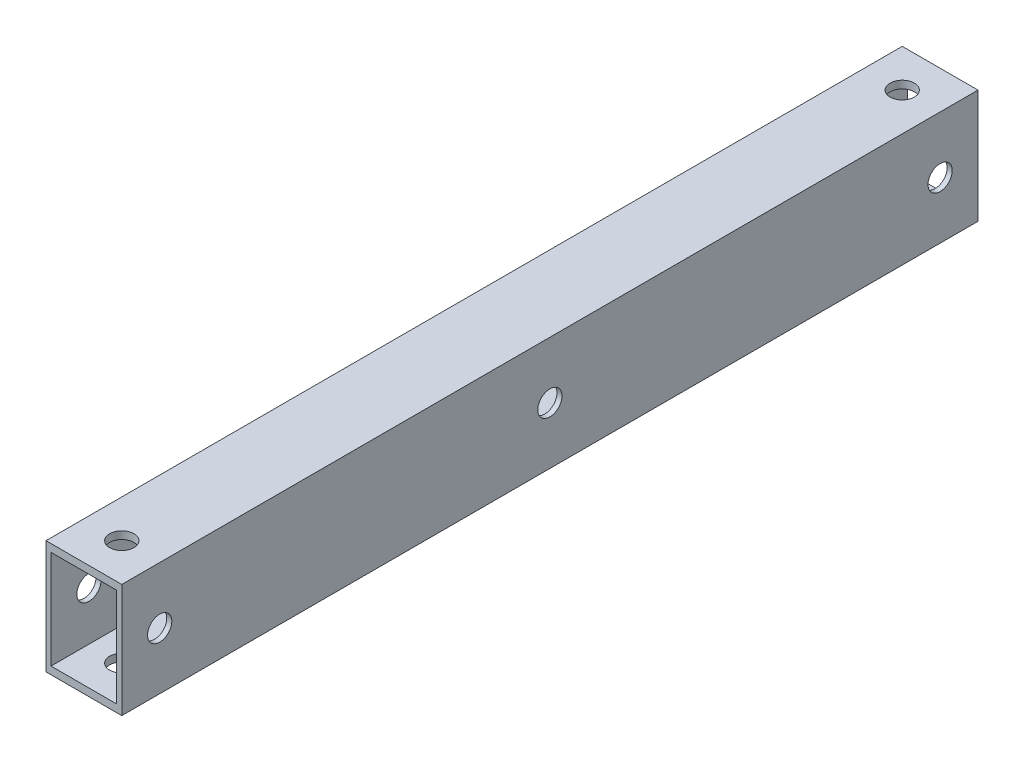
ISO-10303-21;
HEADER;
FILE_DESCRIPTION(('STEP AP214'),'2;1');
FILE_NAME('part.step','',(''),(''),'','','');
FILE_SCHEMA(('AUTOMOTIVE_DESIGN { 1 0 10303 214 1 1 1 1 }'));
ENDSEC;
DATA;
#1=APPLICATION_CONTEXT('core data for automotive mechanical design processes');
#2=APPLICATION_PROTOCOL_DEFINITION('international standard','automotive_design',2000,#1);
#3=PRODUCT_CONTEXT('',#1,'mechanical');
#4=PRODUCT('Part','Part','',(#3));
#5=PRODUCT_RELATED_PRODUCT_CATEGORY('part','',(#4));
#6=PRODUCT_DEFINITION_FORMATION('','',#4);
#7=PRODUCT_DEFINITION_CONTEXT('part definition',#1,'design');
#8=PRODUCT_DEFINITION('design','',#6,#7);
#9=PRODUCT_DEFINITION_SHAPE('','',#8);
#10=(LENGTH_UNIT() NAMED_UNIT(*) SI_UNIT(.MILLI.,.METRE.));
#11=(NAMED_UNIT(*) PLANE_ANGLE_UNIT() SI_UNIT($,.RADIAN.));
#12=(NAMED_UNIT(*) SI_UNIT($,.STERADIAN.) SOLID_ANGLE_UNIT());
#13=UNCERTAINTY_MEASURE_WITH_UNIT(LENGTH_MEASURE(1.E-05),#10,'distance_accuracy_value','');
#14=(GEOMETRIC_REPRESENTATION_CONTEXT(3) GLOBAL_UNCERTAINTY_ASSIGNED_CONTEXT((#13)) GLOBAL_UNIT_ASSIGNED_CONTEXT((#10,
#11,#12)) REPRESENTATION_CONTEXT('',''));
#15=CARTESIAN_POINT('',(0.,0.,0.));
#16=DIRECTION('',(0.,0.,1.));
#17=DIRECTION('',(1.,0.,0.));
#18=AXIS2_PLACEMENT_3D('',#15,#16,#17);
#19=CARTESIAN_POINT('',(5.,-7.5,56.5));
#20=DIRECTION('',(-1.,0.,0.));
#21=DIRECTION('',(0.,0.,1.));
#22=AXIS2_PLACEMENT_3D('',#19,#20,#21);
#23=PLANE('',#22);
#24=CARTESIAN_POINT('',(5.,0.,-51.5));
#25=DIRECTION('',(1.,0.,0.));
#26=DIRECTION('',(0.,0.,-1.));
#27=AXIS2_PLACEMENT_3D('',#24,#25,#26);
#28=CIRCLE('',#27,1.6);
#29=CARTESIAN_POINT('',(5.,0.,-53.1));
#30=VERTEX_POINT('',#29);
#31=EDGE_CURVE('E220',#30,#30,#28,.T.);
#32=ORIENTED_EDGE('',*,*,#31,.F.);
#33=EDGE_LOOP('',(#32));
#34=FACE_BOUND('',#33,.T.);
#35=DIRECTION('',(0.,0.,-1.));
#36=VECTOR('',#35,1.);
#37=CARTESIAN_POINT('',(5.,-7.5,56.5));
#38=LINE('',#37,#36);
#39=CARTESIAN_POINT('',(5.,-7.5,56.5));
#40=VERTEX_POINT('',#39);
#41=CARTESIAN_POINT('',(5.,-7.5,-56.5));
#42=VERTEX_POINT('',#41);
#43=EDGE_CURVE('E190',#40,#42,#38,.T.);
#44=ORIENTED_EDGE('',*,*,#43,.T.);
#45=DIRECTION('',(0.,1.,0.));
#46=VECTOR('',#45,1.);
#47=CARTESIAN_POINT('',(5.,-7.5,-56.5));
#48=LINE('',#47,#46);
#49=CARTESIAN_POINT('',(5.,7.5,-56.5));
#50=VERTEX_POINT('',#49);
#51=EDGE_CURVE('E131',#42,#50,#48,.T.);
#52=ORIENTED_EDGE('',*,*,#51,.T.);
#53=DIRECTION('',(0.,0.,-1.));
#54=VECTOR('',#53,1.);
#55=CARTESIAN_POINT('',(5.,7.5,56.5));
#56=LINE('',#55,#54);
#57=CARTESIAN_POINT('',(5.,7.5,56.5));
#58=VERTEX_POINT('',#57);
#59=EDGE_CURVE('E42',#58,#50,#56,.T.);
#60=ORIENTED_EDGE('',*,*,#59,.F.);
#61=DIRECTION('',(0.,1.,0.));
#62=VECTOR('',#61,1.);
#63=CARTESIAN_POINT('',(5.,-7.5,56.5));
#64=LINE('',#63,#62);
#65=EDGE_CURVE('E183',#40,#58,#64,.T.);
#66=ORIENTED_EDGE('',*,*,#65,.F.);
#67=EDGE_LOOP('',(#44,#52,#60,#66));
#68=FACE_BOUND('',#67,.T.);
#69=CARTESIAN_POINT('',(5.,0.,51.5));
#70=DIRECTION('',(-1.,0.,0.));
#71=DIRECTION('',(0.,0.,1.));
#72=AXIS2_PLACEMENT_3D('',#69,#70,#71);
#73=CIRCLE('',#72,1.6);
#74=CARTESIAN_POINT('',(5.,0.,53.1));
#75=VERTEX_POINT('',#74);
#76=EDGE_CURVE('E144',#75,#75,#73,.T.);
#77=ORIENTED_EDGE('',*,*,#76,.T.);
#78=EDGE_LOOP('',(#77));
#79=FACE_BOUND('',#78,.T.);
#80=CARTESIAN_POINT('',(5.,0.,0.));
#81=DIRECTION('',(1.,0.,0.));
#82=DIRECTION('',(0.,0.,-1.));
#83=AXIS2_PLACEMENT_3D('',#80,#81,#82);
#84=CIRCLE('',#83,1.6);
#85=CARTESIAN_POINT('',(5.,0.,-1.6));
#86=VERTEX_POINT('',#85);
#87=EDGE_CURVE('E163',#86,#86,#84,.T.);
#88=ORIENTED_EDGE('',*,*,#87,.F.);
#89=EDGE_LOOP('',(#88));
#90=FACE_BOUND('',#89,.T.);
#91=ADVANCED_FACE('F34',(#34,#68,#79,#90),#23,.F.);
#92=CARTESIAN_POINT('',(4.33333333333333,-6.5,56.5));
#93=DIRECTION('',(-1.,0.,0.));
#94=DIRECTION('',(0.,0.,1.));
#95=AXIS2_PLACEMENT_3D('',#92,#93,#94);
#96=PLANE('',#95);
#97=CARTESIAN_POINT('',(4.33333333333333,0.,-51.5));
#98=DIRECTION('',(-1.,0.,0.));
#99=DIRECTION('',(0.,0.,1.));
#100=AXIS2_PLACEMENT_3D('',#97,#98,#99);
#101=CIRCLE('',#100,1.6);
#102=CARTESIAN_POINT('',(4.33333333333333,0.,-49.9));
#103=VERTEX_POINT('',#102);
#104=EDGE_CURVE('E212',#103,#103,#101,.F.);
#105=ORIENTED_EDGE('',*,*,#104,.T.);
#106=EDGE_LOOP('',(#105));
#107=FACE_BOUND('',#106,.T.);
#108=CARTESIAN_POINT('',(4.33333333333333,0.,51.5));
#109=DIRECTION('',(-1.,0.,0.));
#110=DIRECTION('',(0.,0.,1.));
#111=AXIS2_PLACEMENT_3D('',#108,#109,#110);
#112=CIRCLE('',#111,1.6);
#113=CARTESIAN_POINT('',(4.33333333333333,0.,53.1));
#114=VERTEX_POINT('',#113);
#115=EDGE_CURVE('E150',#114,#114,#112,.T.);
#116=ORIENTED_EDGE('',*,*,#115,.F.);
#117=EDGE_LOOP('',(#116));
#118=FACE_BOUND('',#117,.T.);
#119=DIRECTION('',(0.,1.,0.));
#120=VECTOR('',#119,1.);
#121=CARTESIAN_POINT('',(4.33333333333333,-6.5,-56.5));
#122=LINE('',#121,#120);
#123=CARTESIAN_POINT('',(4.33333333333333,-6.5,-56.5));
#124=VERTEX_POINT('',#123);
#125=CARTESIAN_POINT('',(4.33333333333333,6.5,-56.5));
#126=VERTEX_POINT('',#125);
#127=EDGE_CURVE('E111',#124,#126,#122,.T.);
#128=ORIENTED_EDGE('',*,*,#127,.F.);
#129=DIRECTION('',(0.,0.,-1.));
#130=VECTOR('',#129,1.);
#131=CARTESIAN_POINT('',(4.33333333333333,-6.5,56.5));
#132=LINE('',#131,#130);
#133=CARTESIAN_POINT('',(4.33333333333333,-6.5,56.5));
#134=VERTEX_POINT('',#133);
#135=EDGE_CURVE('E99',#134,#124,#132,.T.);
#136=ORIENTED_EDGE('',*,*,#135,.F.);
#137=DIRECTION('',(0.,1.,0.));
#138=VECTOR('',#137,1.);
#139=CARTESIAN_POINT('',(4.33333333333333,-6.5,56.5));
#140=LINE('',#139,#138);
#141=CARTESIAN_POINT('',(4.33333333333333,6.5,56.5));
#142=VERTEX_POINT('',#141);
#143=EDGE_CURVE('E172',#134,#142,#140,.T.);
#144=ORIENTED_EDGE('',*,*,#143,.T.);
#145=DIRECTION('',(0.,0.,-1.));
#146=VECTOR('',#145,1.);
#147=CARTESIAN_POINT('',(4.33333333333333,6.5,56.5));
#148=LINE('',#147,#146);
#149=EDGE_CURVE('E115',#142,#126,#148,.T.);
#150=ORIENTED_EDGE('',*,*,#149,.T.);
#151=EDGE_LOOP('',(#128,#136,#144,#150));
#152=FACE_BOUND('',#151,.T.);
#153=CARTESIAN_POINT('',(4.33333333333334,0.,0.));
#154=DIRECTION('',(-1.,0.,0.));
#155=DIRECTION('',(0.,0.,1.));
#156=AXIS2_PLACEMENT_3D('',#153,#154,#155);
#157=CIRCLE('',#156,1.6);
#158=CARTESIAN_POINT('',(4.33333333333334,0.,1.6));
#159=VERTEX_POINT('',#158);
#160=EDGE_CURVE('E167',#159,#159,#157,.T.);
#161=ORIENTED_EDGE('',*,*,#160,.F.);
#162=EDGE_LOOP('',(#161));
#163=FACE_BOUND('',#162,.T.);
#164=ADVANCED_FACE('F112',(#107,#118,#152,#163),#96,.T.);
#165=CARTESIAN_POINT('',(0.,0.,56.5));
#166=DIRECTION('',(0.,0.,-1.));
#167=DIRECTION('',(-1.,0.,0.));
#168=AXIS2_PLACEMENT_3D('',#165,#166,#167);
#169=PLANE('',#168);
#170=ORIENTED_EDGE('',*,*,#65,.T.);
#171=DIRECTION('',(-1.,0.,0.));
#172=VECTOR('',#171,1.);
#173=CARTESIAN_POINT('',(-5.,7.5,56.5));
#174=LINE('',#173,#172);
#175=CARTESIAN_POINT('',(-5.,7.5,56.5));
#176=VERTEX_POINT('',#175);
#177=EDGE_CURVE('E185',#58,#176,#174,.T.);
#178=ORIENTED_EDGE('',*,*,#177,.T.);
#179=DIRECTION('',(0.,-1.,0.));
#180=VECTOR('',#179,1.);
#181=CARTESIAN_POINT('',(-5.,-7.5,56.5));
#182=LINE('',#181,#180);
#183=CARTESIAN_POINT('',(-5.,-7.5,56.5));
#184=VERTEX_POINT('',#183);
#185=EDGE_CURVE('E187',#176,#184,#182,.T.);
#186=ORIENTED_EDGE('',*,*,#185,.T.);
#187=DIRECTION('',(1.,0.,0.));
#188=VECTOR('',#187,1.);
#189=CARTESIAN_POINT('',(-5.,-7.5,56.5));
#190=LINE('',#189,#188);
#191=EDGE_CURVE('E58',#184,#40,#190,.T.);
#192=ORIENTED_EDGE('',*,*,#191,.T.);
#193=EDGE_LOOP('',(#170,#178,#186,#192));
#194=FACE_BOUND('',#193,.T.);
#195=ORIENTED_EDGE('',*,*,#143,.F.);
#196=DIRECTION('',(1.,0.,0.));
#197=VECTOR('',#196,1.);
#198=CARTESIAN_POINT('',(-4.33333333333334,-6.5,56.5));
#199=LINE('',#198,#197);
#200=CARTESIAN_POINT('',(-4.33333333333334,-6.5,56.5));
#201=VERTEX_POINT('',#200);
#202=EDGE_CURVE('E106',#201,#134,#199,.T.);
#203=ORIENTED_EDGE('',*,*,#202,.F.);
#204=DIRECTION('',(0.,-1.,0.));
#205=VECTOR('',#204,1.);
#206=CARTESIAN_POINT('',(-4.33333333333334,-6.5,56.5));
#207=LINE('',#206,#205);
#208=CARTESIAN_POINT('',(-4.33333333333334,6.5,56.5));
#209=VERTEX_POINT('',#208);
#210=EDGE_CURVE('E176',#209,#201,#207,.T.);
#211=ORIENTED_EDGE('',*,*,#210,.F.);
#212=DIRECTION('',(-1.,0.,0.));
#213=VECTOR('',#212,1.);
#214=CARTESIAN_POINT('',(-4.33333333333334,6.5,56.5));
#215=LINE('',#214,#213);
#216=EDGE_CURVE('E174',#142,#209,#215,.T.);
#217=ORIENTED_EDGE('',*,*,#216,.F.);
#218=EDGE_LOOP('',(#195,#203,#211,#217));
#219=FACE_BOUND('',#218,.T.);
#220=ADVANCED_FACE('F261',(#194,#219),#169,.F.);
#221=CARTESIAN_POINT('',(-5.,7.5,56.5));
#222=DIRECTION('',(0.,-1.,0.));
#223=DIRECTION('',(0.,0.,-1.));
#224=AXIS2_PLACEMENT_3D('',#221,#222,#223);
#225=PLANE('',#224);
#226=CARTESIAN_POINT('',(0.,7.5,-51.5));
#227=DIRECTION('',(0.,-1.,0.));
#228=DIRECTION('',(0.,0.,-1.));
#229=AXIS2_PLACEMENT_3D('',#226,#227,#228);
#230=CIRCLE('',#229,1.6);
#231=CARTESIAN_POINT('',(0.,7.5,-53.1));
#232=VERTEX_POINT('',#231);
#233=EDGE_CURVE('E207',#232,#232,#230,.T.);
#234=ORIENTED_EDGE('',*,*,#233,.T.);
#235=EDGE_LOOP('',(#234));
#236=FACE_BOUND('',#235,.T.);
#237=CARTESIAN_POINT('',(0.,7.5,51.5));
#238=DIRECTION('',(0.,1.,0.));
#239=DIRECTION('',(0.,0.,1.));
#240=AXIS2_PLACEMENT_3D('',#237,#238,#239);
#241=CIRCLE('',#240,1.6);
#242=CARTESIAN_POINT('',(0.,7.5,53.1));
#243=VERTEX_POINT('',#242);
#244=EDGE_CURVE('E153',#243,#243,#241,.T.);
#245=ORIENTED_EDGE('',*,*,#244,.F.);
#246=EDGE_LOOP('',(#245));
#247=FACE_BOUND('',#246,.T.);
#248=ORIENTED_EDGE('',*,*,#59,.T.);
#249=DIRECTION('',(-1.,0.,0.));
#250=VECTOR('',#249,1.);
#251=CARTESIAN_POINT('',(-5.,7.5,-56.5));
#252=LINE('',#251,#250);
#253=CARTESIAN_POINT('',(-5.,7.5,-56.5));
#254=VERTEX_POINT('',#253);
#255=EDGE_CURVE('E140',#50,#254,#252,.T.);
#256=ORIENTED_EDGE('',*,*,#255,.T.);
#257=DIRECTION('',(0.,0.,-1.));
#258=VECTOR('',#257,1.);
#259=CARTESIAN_POINT('',(-5.,7.5,56.5));
#260=LINE('',#259,#258);
#261=EDGE_CURVE('E194',#176,#254,#260,.T.);
#262=ORIENTED_EDGE('',*,*,#261,.F.);
#263=ORIENTED_EDGE('',*,*,#177,.F.);
#264=EDGE_LOOP('',(#248,#256,#262,#263));
#265=FACE_BOUND('',#264,.T.);
#266=ADVANCED_FACE('F242',(#236,#247,#265),#225,.F.);
#267=CARTESIAN_POINT('',(-5.,-7.5,56.5));
#268=DIRECTION('',(1.,0.,0.));
#269=DIRECTION('',(0.,0.,-1.));
#270=AXIS2_PLACEMENT_3D('',#267,#268,#269);
#271=PLANE('',#270);
#272=CARTESIAN_POINT('',(-5.,0.,-51.5));
#273=DIRECTION('',(1.,0.,0.));
#274=DIRECTION('',(0.,0.,-1.));
#275=AXIS2_PLACEMENT_3D('',#272,#273,#274);
#276=CIRCLE('',#275,1.6);
#277=CARTESIAN_POINT('',(-5.,0.,-53.1));
#278=VERTEX_POINT('',#277);
#279=EDGE_CURVE('E217',#278,#278,#276,.T.);
#280=ORIENTED_EDGE('',*,*,#279,.T.);
#281=EDGE_LOOP('',(#280));
#282=FACE_BOUND('',#281,.T.);
#283=CARTESIAN_POINT('',(-5.,0.,0.));
#284=DIRECTION('',(1.,0.,0.));
#285=DIRECTION('',(0.,0.,-1.));
#286=AXIS2_PLACEMENT_3D('',#283,#284,#285);
#287=CIRCLE('',#286,1.6);
#288=CARTESIAN_POINT('',(-5.,0.,-1.6));
#289=VERTEX_POINT('',#288);
#290=EDGE_CURVE('E164',#289,#289,#287,.T.);
#291=ORIENTED_EDGE('',*,*,#290,.T.);
#292=EDGE_LOOP('',(#291));
#293=FACE_BOUND('',#292,.T.);
#294=CARTESIAN_POINT('',(-5.,0.,51.5));
#295=DIRECTION('',(-1.,0.,0.));
#296=DIRECTION('',(0.,0.,1.));
#297=AXIS2_PLACEMENT_3D('',#294,#295,#296);
#298=CIRCLE('',#297,1.6);
#299=CARTESIAN_POINT('',(-5.,0.,53.1));
#300=VERTEX_POINT('',#299);
#301=EDGE_CURVE('E143',#300,#300,#298,.T.);
#302=ORIENTED_EDGE('',*,*,#301,.F.);
#303=EDGE_LOOP('',(#302));
#304=FACE_BOUND('',#303,.T.);
#305=ORIENTED_EDGE('',*,*,#261,.T.);
#306=DIRECTION('',(0.,-1.,0.));
#307=VECTOR('',#306,1.);
#308=CARTESIAN_POINT('',(-5.,-7.5,-56.5));
#309=LINE('',#308,#307);
#310=CARTESIAN_POINT('',(-5.,-7.5,-56.5));
#311=VERTEX_POINT('',#310);
#312=EDGE_CURVE('E137',#254,#311,#309,.T.);
#313=ORIENTED_EDGE('',*,*,#312,.T.);
#314=DIRECTION('',(0.,0.,-1.));
#315=VECTOR('',#314,1.);
#316=CARTESIAN_POINT('',(-5.,-7.5,56.5));
#317=LINE('',#316,#315);
#318=EDGE_CURVE('E192',#184,#311,#317,.T.);
#319=ORIENTED_EDGE('',*,*,#318,.F.);
#320=ORIENTED_EDGE('',*,*,#185,.F.);
#321=EDGE_LOOP('',(#305,#313,#319,#320));
#322=FACE_BOUND('',#321,.T.);
#323=ADVANCED_FACE('F238',(#282,#293,#304,#322),#271,.F.);
#324=CARTESIAN_POINT('',(-5.,-7.5,56.5));
#325=DIRECTION('',(0.,1.,0.));
#326=DIRECTION('',(0.,0.,1.));
#327=AXIS2_PLACEMENT_3D('',#324,#325,#326);
#328=PLANE('',#327);
#329=CARTESIAN_POINT('',(0.,-7.5,-51.5));
#330=DIRECTION('',(0.,-1.,0.));
#331=DIRECTION('',(0.,0.,-1.));
#332=AXIS2_PLACEMENT_3D('',#329,#330,#331);
#333=CIRCLE('',#332,1.6);
#334=CARTESIAN_POINT('',(0.,-7.5,-53.1));
#335=VERTEX_POINT('',#334);
#336=EDGE_CURVE('E202',#335,#335,#333,.T.);
#337=ORIENTED_EDGE('',*,*,#336,.F.);
#338=EDGE_LOOP('',(#337));
#339=FACE_BOUND('',#338,.T.);
#340=CARTESIAN_POINT('',(0.,-7.5,51.5));
#341=DIRECTION('',(0.,1.,0.));
#342=DIRECTION('',(0.,0.,1.));
#343=AXIS2_PLACEMENT_3D('',#340,#341,#342);
#344=CIRCLE('',#343,1.6);
#345=CARTESIAN_POINT('',(0.,-7.5,53.1));
#346=VERTEX_POINT('',#345);
#347=EDGE_CURVE('E154',#346,#346,#344,.T.);
#348=ORIENTED_EDGE('',*,*,#347,.T.);
#349=EDGE_LOOP('',(#348));
#350=FACE_BOUND('',#349,.T.);
#351=ORIENTED_EDGE('',*,*,#318,.T.);
#352=DIRECTION('',(1.,0.,0.));
#353=VECTOR('',#352,1.);
#354=CARTESIAN_POINT('',(-5.,-7.5,-56.5));
#355=LINE('',#354,#353);
#356=EDGE_CURVE('E134',#311,#42,#355,.T.);
#357=ORIENTED_EDGE('',*,*,#356,.T.);
#358=ORIENTED_EDGE('',*,*,#43,.F.);
#359=ORIENTED_EDGE('',*,*,#191,.F.);
#360=EDGE_LOOP('',(#351,#357,#358,#359));
#361=FACE_BOUND('',#360,.T.);
#362=ADVANCED_FACE('F241',(#339,#350,#361),#328,.F.);
#363=CARTESIAN_POINT('',(-4.33333333333334,6.5,56.5));
#364=DIRECTION('',(0.,-1.,0.));
#365=DIRECTION('',(0.,0.,-1.));
#366=AXIS2_PLACEMENT_3D('',#363,#364,#365);
#367=PLANE('',#366);
#368=CARTESIAN_POINT('',(0.,6.5,-51.5));
#369=DIRECTION('',(0.,-1.,0.));
#370=DIRECTION('',(0.,0.,-1.));
#371=AXIS2_PLACEMENT_3D('',#368,#369,#370);
#372=CIRCLE('',#371,1.6);
#373=CARTESIAN_POINT('',(0.,6.5,-53.1));
#374=VERTEX_POINT('',#373);
#375=EDGE_CURVE('E119',#374,#374,#372,.F.);
#376=ORIENTED_EDGE('',*,*,#375,.T.);
#377=EDGE_LOOP('',(#376));
#378=FACE_BOUND('',#377,.T.);
#379=CARTESIAN_POINT('',(0.,6.5,51.5));
#380=DIRECTION('',(0.,-1.,0.));
#381=DIRECTION('',(0.,0.,-1.));
#382=AXIS2_PLACEMENT_3D('',#379,#380,#381);
#383=CIRCLE('',#382,1.6);
#384=CARTESIAN_POINT('',(0.,6.5,49.9));
#385=VERTEX_POINT('',#384);
#386=EDGE_CURVE('E160',#385,#385,#383,.T.);
#387=ORIENTED_EDGE('',*,*,#386,.F.);
#388=EDGE_LOOP('',(#387));
#389=FACE_BOUND('',#388,.T.);
#390=DIRECTION('',(0.,0.,-1.));
#391=VECTOR('',#390,1.);
#392=CARTESIAN_POINT('',(-4.33333333333334,6.5,56.5));
#393=LINE('',#392,#391);
#394=CARTESIAN_POINT('',(-4.33333333333334,6.5,-56.5));
#395=VERTEX_POINT('',#394);
#396=EDGE_CURVE('E180',#209,#395,#393,.T.);
#397=ORIENTED_EDGE('',*,*,#396,.T.);
#398=DIRECTION('',(-1.,0.,0.));
#399=VECTOR('',#398,1.);
#400=CARTESIAN_POINT('',(-4.33333333333334,6.5,-56.5));
#401=LINE('',#400,#399);
#402=EDGE_CURVE('E126',#126,#395,#401,.T.);
#403=ORIENTED_EDGE('',*,*,#402,.F.);
#404=ORIENTED_EDGE('',*,*,#149,.F.);
#405=ORIENTED_EDGE('',*,*,#216,.T.);
#406=EDGE_LOOP('',(#397,#403,#404,#405));
#407=FACE_BOUND('',#406,.T.);
#408=ADVANCED_FACE('F268',(#378,#389,#407),#367,.T.);
#409=CARTESIAN_POINT('',(-4.33333333333334,-6.5,56.5));
#410=DIRECTION('',(1.,0.,0.));
#411=DIRECTION('',(0.,0.,-1.));
#412=AXIS2_PLACEMENT_3D('',#409,#410,#411);
#413=PLANE('',#412);
#414=CARTESIAN_POINT('',(-4.33333333333334,0.,-51.5));
#415=DIRECTION('',(1.,0.,0.));
#416=DIRECTION('',(0.,0.,-1.));
#417=AXIS2_PLACEMENT_3D('',#414,#415,#416);
#418=CIRCLE('',#417,1.6);
#419=CARTESIAN_POINT('',(-4.33333333333334,0.,-53.1));
#420=VERTEX_POINT('',#419);
#421=EDGE_CURVE('E37',#420,#420,#418,.F.);
#422=ORIENTED_EDGE('',*,*,#421,.T.);
#423=EDGE_LOOP('',(#422));
#424=FACE_BOUND('',#423,.T.);
#425=CARTESIAN_POINT('',(-4.33333333333334,0.,0.));
#426=DIRECTION('',(1.,0.,0.));
#427=DIRECTION('',(0.,0.,-1.));
#428=AXIS2_PLACEMENT_3D('',#425,#426,#427);
#429=CIRCLE('',#428,1.6);
#430=CARTESIAN_POINT('',(-4.33333333333334,0.,-1.6));
#431=VERTEX_POINT('',#430);
#432=EDGE_CURVE('E11',#431,#431,#429,.T.);
#433=ORIENTED_EDGE('',*,*,#432,.F.);
#434=EDGE_LOOP('',(#433));
#435=FACE_BOUND('',#434,.T.);
#436=CARTESIAN_POINT('',(-4.33333333333334,0.,51.5));
#437=DIRECTION('',(1.,0.,0.));
#438=DIRECTION('',(0.,0.,-1.));
#439=AXIS2_PLACEMENT_3D('',#436,#437,#438);
#440=CIRCLE('',#439,1.6);
#441=CARTESIAN_POINT('',(-4.33333333333334,0.,49.9));
#442=VERTEX_POINT('',#441);
#443=EDGE_CURVE('E147',#442,#442,#440,.T.);
#444=ORIENTED_EDGE('',*,*,#443,.F.);
#445=EDGE_LOOP('',(#444));
#446=FACE_BOUND('',#445,.T.);
#447=DIRECTION('',(0.,-1.,0.));
#448=VECTOR('',#447,1.);
#449=CARTESIAN_POINT('',(-4.33333333333334,-6.5,-56.5));
#450=LINE('',#449,#448);
#451=CARTESIAN_POINT('',(-4.33333333333334,-6.5,-56.5));
#452=VERTEX_POINT('',#451);
#453=EDGE_CURVE('E124',#395,#452,#450,.T.);
#454=ORIENTED_EDGE('',*,*,#453,.F.);
#455=ORIENTED_EDGE('',*,*,#396,.F.);
#456=ORIENTED_EDGE('',*,*,#210,.T.);
#457=DIRECTION('',(0.,0.,-1.));
#458=VECTOR('',#457,1.);
#459=CARTESIAN_POINT('',(-4.33333333333334,-6.5,56.5));
#460=LINE('',#459,#458);
#461=EDGE_CURVE('E50',#201,#452,#460,.T.);
#462=ORIENTED_EDGE('',*,*,#461,.T.);
#463=EDGE_LOOP('',(#454,#455,#456,#462));
#464=FACE_BOUND('',#463,.T.);
#465=ADVANCED_FACE('F227',(#424,#435,#446,#464),#413,.T.);
#466=CARTESIAN_POINT('',(-4.33333333333334,-6.5,56.5));
#467=DIRECTION('',(0.,1.,0.));
#468=DIRECTION('',(0.,0.,1.));
#469=AXIS2_PLACEMENT_3D('',#466,#467,#468);
#470=PLANE('',#469);
#471=CARTESIAN_POINT('',(0.,-6.5,-51.5));
#472=DIRECTION('',(0.,1.,0.));
#473=DIRECTION('',(0.,0.,1.));
#474=AXIS2_PLACEMENT_3D('',#471,#472,#473);
#475=CIRCLE('',#474,1.6);
#476=CARTESIAN_POINT('',(0.,-6.5,-49.9));
#477=VERTEX_POINT('',#476);
#478=EDGE_CURVE('E200',#477,#477,#475,.F.);
#479=ORIENTED_EDGE('',*,*,#478,.T.);
#480=EDGE_LOOP('',(#479));
#481=FACE_BOUND('',#480,.T.);
#482=CARTESIAN_POINT('',(0.,-6.5,51.5));
#483=DIRECTION('',(0.,1.,0.));
#484=DIRECTION('',(0.,0.,1.));
#485=AXIS2_PLACEMENT_3D('',#482,#483,#484);
#486=CIRCLE('',#485,1.6);
#487=CARTESIAN_POINT('',(0.,-6.5,53.1));
#488=VERTEX_POINT('',#487);
#489=EDGE_CURVE('E157',#488,#488,#486,.T.);
#490=ORIENTED_EDGE('',*,*,#489,.F.);
#491=EDGE_LOOP('',(#490));
#492=FACE_BOUND('',#491,.T.);
#493=ORIENTED_EDGE('',*,*,#135,.T.);
#494=DIRECTION('',(1.,0.,0.));
#495=VECTOR('',#494,1.);
#496=CARTESIAN_POINT('',(-4.33333333333334,-6.5,-56.5));
#497=LINE('',#496,#495);
#498=EDGE_CURVE('E103',#452,#124,#497,.T.);
#499=ORIENTED_EDGE('',*,*,#498,.F.);
#500=ORIENTED_EDGE('',*,*,#461,.F.);
#501=ORIENTED_EDGE('',*,*,#202,.T.);
#502=EDGE_LOOP('',(#493,#499,#500,#501));
#503=FACE_BOUND('',#502,.T.);
#504=ADVANCED_FACE('F101',(#481,#492,#503),#470,.T.);
#505=CARTESIAN_POINT('',(-5.,0.,0.));
#506=DIRECTION('',(1.,0.,0.));
#507=DIRECTION('',(0.,0.,-1.));
#508=AXIS2_PLACEMENT_3D('',#505,#506,#507);
#509=CYLINDRICAL_SURFACE('',#508,1.6);
#510=ORIENTED_EDGE('',*,*,#290,.F.);
#511=EDGE_LOOP('',(#510));
#512=FACE_BOUND('',#511,.T.);
#513=ORIENTED_EDGE('',*,*,#432,.T.);
#514=EDGE_LOOP('',(#513));
#515=FACE_BOUND('',#514,.T.);
#516=ADVANCED_FACE('F277',(#512,#515),#509,.F.);
#517=ORIENTED_EDGE('',*,*,#160,.T.);
#518=EDGE_LOOP('',(#517));
#519=FACE_BOUND('',#518,.T.);
#520=ORIENTED_EDGE('',*,*,#87,.T.);
#521=EDGE_LOOP('',(#520));
#522=FACE_BOUND('',#521,.T.);
#523=ADVANCED_FACE('F315',(#519,#522),#509,.F.);
#524=CARTESIAN_POINT('',(0.,-7.5,51.5));
#525=DIRECTION('',(0.,1.,0.));
#526=DIRECTION('',(0.,0.,1.));
#527=AXIS2_PLACEMENT_3D('',#524,#525,#526);
#528=CYLINDRICAL_SURFACE('',#527,1.6);
#529=ORIENTED_EDGE('',*,*,#489,.T.);
#530=EDGE_LOOP('',(#529));
#531=FACE_BOUND('',#530,.T.);
#532=ORIENTED_EDGE('',*,*,#347,.F.);
#533=EDGE_LOOP('',(#532));
#534=FACE_BOUND('',#533,.T.);
#535=ADVANCED_FACE('F305',(#531,#534),#528,.F.);
#536=ORIENTED_EDGE('',*,*,#386,.T.);
#537=EDGE_LOOP('',(#536));
#538=FACE_BOUND('',#537,.T.);
#539=ORIENTED_EDGE('',*,*,#244,.T.);
#540=EDGE_LOOP('',(#539));
#541=FACE_BOUND('',#540,.T.);
#542=ADVANCED_FACE('F302',(#538,#541),#528,.F.);
#543=CARTESIAN_POINT('',(5.,0.,51.5));
#544=DIRECTION('',(-1.,0.,0.));
#545=DIRECTION('',(0.,0.,1.));
#546=AXIS2_PLACEMENT_3D('',#543,#544,#545);
#547=CYLINDRICAL_SURFACE('',#546,1.6);
#548=ORIENTED_EDGE('',*,*,#443,.T.);
#549=EDGE_LOOP('',(#548));
#550=FACE_BOUND('',#549,.T.);
#551=ORIENTED_EDGE('',*,*,#301,.T.);
#552=EDGE_LOOP('',(#551));
#553=FACE_BOUND('',#552,.T.);
#554=ADVANCED_FACE('F304',(#550,#553),#547,.F.);
#555=ORIENTED_EDGE('',*,*,#115,.T.);
#556=EDGE_LOOP('',(#555));
#557=FACE_BOUND('',#556,.T.);
#558=ORIENTED_EDGE('',*,*,#76,.F.);
#559=EDGE_LOOP('',(#558));
#560=FACE_BOUND('',#559,.T.);
#561=ADVANCED_FACE('F312',(#557,#560),#547,.F.);
#562=CARTESIAN_POINT('',(0.,0.,-56.5));
#563=DIRECTION('',(0.,0.,1.));
#564=DIRECTION('',(-1.,0.,0.));
#565=AXIS2_PLACEMENT_3D('',#562,#563,#564);
#566=PLANE('',#565);
#567=ORIENTED_EDGE('',*,*,#498,.T.);
#568=ORIENTED_EDGE('',*,*,#127,.T.);
#569=ORIENTED_EDGE('',*,*,#402,.T.);
#570=ORIENTED_EDGE('',*,*,#453,.T.);
#571=EDGE_LOOP('',(#567,#568,#569,#570));
#572=FACE_BOUND('',#571,.T.);
#573=ORIENTED_EDGE('',*,*,#51,.F.);
#574=ORIENTED_EDGE('',*,*,#356,.F.);
#575=ORIENTED_EDGE('',*,*,#312,.F.);
#576=ORIENTED_EDGE('',*,*,#255,.F.);
#577=EDGE_LOOP('',(#573,#574,#575,#576));
#578=FACE_BOUND('',#577,.T.);
#579=ADVANCED_FACE('F121',(#572,#578),#566,.F.);
#580=CARTESIAN_POINT('',(0.,-7.5,-51.5));
#581=DIRECTION('',(0.,1.,0.));
#582=DIRECTION('',(0.,0.,1.));
#583=AXIS2_PLACEMENT_3D('',#580,#581,#582);
#584=CYLINDRICAL_SURFACE('',#583,1.6);
#585=ORIENTED_EDGE('',*,*,#478,.F.);
#586=EDGE_LOOP('',(#585));
#587=FACE_BOUND('',#586,.T.);
#588=ORIENTED_EDGE('',*,*,#336,.T.);
#589=EDGE_LOOP('',(#588));
#590=FACE_BOUND('',#589,.T.);
#591=ADVANCED_FACE('F430',(#587,#590),#584,.F.);
#592=ORIENTED_EDGE('',*,*,#375,.F.);
#593=EDGE_LOOP('',(#592));
#594=FACE_BOUND('',#593,.T.);
#595=ORIENTED_EDGE('',*,*,#233,.F.);
#596=EDGE_LOOP('',(#595));
#597=FACE_BOUND('',#596,.T.);
#598=ADVANCED_FACE('F234',(#594,#597),#584,.F.);
#599=CARTESIAN_POINT('',(5.,0.,-51.5));
#600=DIRECTION('',(-1.,0.,0.));
#601=DIRECTION('',(0.,0.,1.));
#602=AXIS2_PLACEMENT_3D('',#599,#600,#601);
#603=CYLINDRICAL_SURFACE('',#602,1.6);
#604=ORIENTED_EDGE('',*,*,#421,.F.);
#605=EDGE_LOOP('',(#604));
#606=FACE_BOUND('',#605,.T.);
#607=ORIENTED_EDGE('',*,*,#279,.F.);
#608=EDGE_LOOP('',(#607));
#609=FACE_BOUND('',#608,.T.);
#610=ADVANCED_FACE('F230',(#606,#609),#603,.F.);
#611=ORIENTED_EDGE('',*,*,#104,.F.);
#612=EDGE_LOOP('',(#611));
#613=FACE_BOUND('',#612,.T.);
#614=ORIENTED_EDGE('',*,*,#31,.T.);
#615=EDGE_LOOP('',(#614));
#616=FACE_BOUND('',#615,.T.);
#617=ADVANCED_FACE('F233',(#613,#616),#603,.F.);
#618=CLOSED_SHELL('',(#91,#164,#220,#266,#323,#362,#408,#465,#504,#516,#523,#535,#542,#554,#561,
#579,#591,#598,#610,#617));
#619=MANIFOLD_SOLID_BREP('B2',#618);
#620=ADVANCED_BREP_SHAPE_REPRESENTATION('',(#18,#619),#14);
#621=SHAPE_DEFINITION_REPRESENTATION(#9,#620);
ENDSEC;
END-ISO-10303-21;
